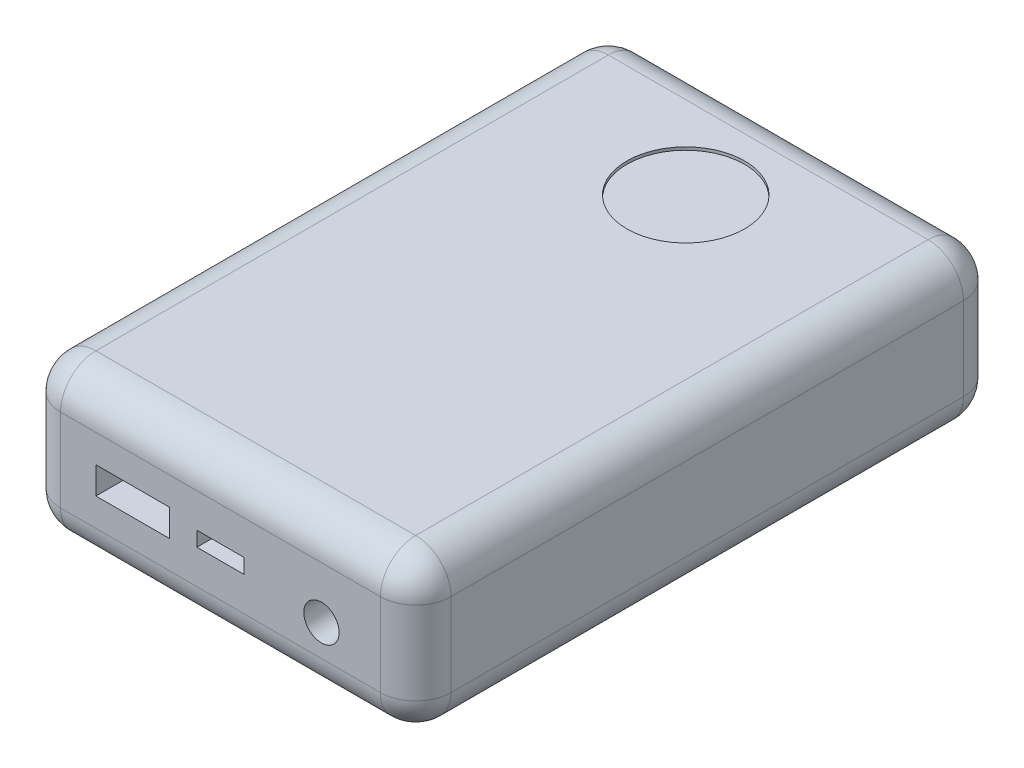
ISO-10303-21;
HEADER;
FILE_DESCRIPTION(('STEP AP214'),'2;1');
FILE_NAME('part.step','',(''),(''),'','','');
FILE_SCHEMA(('AUTOMOTIVE_DESIGN { 1 0 10303 214 1 1 1 1 }'));
ENDSEC;
DATA;
#1=APPLICATION_CONTEXT('core data for automotive mechanical design processes');
#2=APPLICATION_PROTOCOL_DEFINITION('international standard','automotive_design',2000,#1);
#3=PRODUCT_CONTEXT('',#1,'mechanical');
#4=PRODUCT('Part','Part','',(#3));
#5=PRODUCT_RELATED_PRODUCT_CATEGORY('part','',(#4));
#6=PRODUCT_DEFINITION_FORMATION('','',#4);
#7=PRODUCT_DEFINITION_CONTEXT('part definition',#1,'design');
#8=PRODUCT_DEFINITION('design','',#6,#7);
#9=PRODUCT_DEFINITION_SHAPE('','',#8);
#10=(LENGTH_UNIT() NAMED_UNIT(*) SI_UNIT(.MILLI.,.METRE.));
#11=(NAMED_UNIT(*) PLANE_ANGLE_UNIT() SI_UNIT($,.RADIAN.));
#12=(NAMED_UNIT(*) SI_UNIT($,.STERADIAN.) SOLID_ANGLE_UNIT());
#13=UNCERTAINTY_MEASURE_WITH_UNIT(LENGTH_MEASURE(1.E-05),#10,'distance_accuracy_value','');
#14=(GEOMETRIC_REPRESENTATION_CONTEXT(3) GLOBAL_UNCERTAINTY_ASSIGNED_CONTEXT((#13)) GLOBAL_UNIT_ASSIGNED_CONTEXT((#10,
#11,#12)) REPRESENTATION_CONTEXT('',''));
#15=CARTESIAN_POINT('',(0.,0.,0.));
#16=DIRECTION('',(0.,0.,1.));
#17=DIRECTION('',(1.,0.,0.));
#18=AXIS2_PLACEMENT_3D('',#15,#16,#17);
#19=CARTESIAN_POINT('',(-33.15,0.,49.5));
#20=DIRECTION('',(1.,0.,0.));
#21=DIRECTION('',(0.,0.,-1.));
#22=AXIS2_PLACEMENT_3D('',#19,#20,#21);
#23=PLANE('',#22);
#24=DIRECTION('',(0.,0.,-1.));
#25=VECTOR('',#24,1.);
#26=CARTESIAN_POINT('',(-33.15,20.1,49.5));
#27=LINE('',#26,#25);
#28=CARTESIAN_POINT('',(-33.15,20.1,43.5));
#29=VERTEX_POINT('',#28);
#30=CARTESIAN_POINT('',(-33.15,20.1,-43.5));
#31=VERTEX_POINT('',#30);
#32=EDGE_CURVE('E286',#29,#31,#27,.T.);
#33=ORIENTED_EDGE('',*,*,#32,.T.);
#34=DIRECTION('',(0.,-1.,0.));
#35=VECTOR('',#34,1.);
#36=CARTESIAN_POINT('',(-33.15,0.,-43.5));
#37=LINE('',#36,#35);
#38=CARTESIAN_POINT('',(-33.15,6.,-43.5));
#39=VERTEX_POINT('',#38);
#40=EDGE_CURVE('E287',#31,#39,#37,.T.);
#41=ORIENTED_EDGE('',*,*,#40,.T.);
#42=DIRECTION('',(0.,0.,-1.));
#43=VECTOR('',#42,1.);
#44=CARTESIAN_POINT('',(-33.15,6.,49.5));
#45=LINE('',#44,#43);
#46=CARTESIAN_POINT('',(-33.15,6.,43.5));
#47=VERTEX_POINT('',#46);
#48=EDGE_CURVE('E282',#39,#47,#45,.F.);
#49=ORIENTED_EDGE('',*,*,#48,.T.);
#50=DIRECTION('',(0.,-1.,0.));
#51=VECTOR('',#50,1.);
#52=CARTESIAN_POINT('',(-33.15,0.,43.5));
#53=LINE('',#52,#51);
#54=EDGE_CURVE('E281',#47,#29,#53,.F.);
#55=ORIENTED_EDGE('',*,*,#54,.T.);
#56=EDGE_LOOP('',(#33,#41,#49,#55));
#57=FACE_BOUND('',#56,.T.);
#58=ADVANCED_FACE('F45',(#57),#23,.F.);
#59=CARTESIAN_POINT('',(-33.15,0.,49.5));
#60=DIRECTION('',(0.,1.,0.));
#61=DIRECTION('',(0.,0.,1.));
#62=AXIS2_PLACEMENT_3D('',#59,#60,#61);
#63=PLANE('',#62);
#64=DIRECTION('',(0.,0.,-1.));
#65=VECTOR('',#64,1.);
#66=CARTESIAN_POINT('',(-27.15,0.,49.5));
#67=LINE('',#66,#65);
#68=CARTESIAN_POINT('',(-27.15,0.,43.5));
#69=VERTEX_POINT('',#68);
#70=CARTESIAN_POINT('',(-27.15,0.,-43.5));
#71=VERTEX_POINT('',#70);
#72=EDGE_CURVE('E51',#69,#71,#67,.T.);
#73=ORIENTED_EDGE('',*,*,#72,.T.);
#74=DIRECTION('',(1.,0.,0.));
#75=VECTOR('',#74,1.);
#76=CARTESIAN_POINT('',(33.15,0.,-43.5));
#77=LINE('',#76,#75);
#78=CARTESIAN_POINT('',(27.15,0.,-43.5));
#79=VERTEX_POINT('',#78);
#80=EDGE_CURVE('E11',#71,#79,#77,.T.);
#81=ORIENTED_EDGE('',*,*,#80,.T.);
#82=DIRECTION('',(0.,0.,-1.));
#83=VECTOR('',#82,1.);
#84=CARTESIAN_POINT('',(27.15,0.,49.5));
#85=LINE('',#84,#83);
#86=CARTESIAN_POINT('',(27.15,0.,43.5));
#87=VERTEX_POINT('',#86);
#88=EDGE_CURVE('E302',#79,#87,#85,.F.);
#89=ORIENTED_EDGE('',*,*,#88,.T.);
#90=DIRECTION('',(1.,0.,0.));
#91=VECTOR('',#90,1.);
#92=CARTESIAN_POINT('',(-33.15,0.,43.5));
#93=LINE('',#92,#91);
#94=EDGE_CURVE('E65',#87,#69,#93,.F.);
#95=ORIENTED_EDGE('',*,*,#94,.T.);
#96=EDGE_LOOP('',(#73,#81,#89,#95));
#97=FACE_BOUND('',#96,.T.);
#98=ADVANCED_FACE('F408',(#97),#63,.F.);
#99=CARTESIAN_POINT('',(33.15,0.,49.5));
#100=DIRECTION('',(-1.,0.,0.));
#101=DIRECTION('',(0.,0.,1.));
#102=AXIS2_PLACEMENT_3D('',#99,#100,#101);
#103=PLANE('',#102);
#104=DIRECTION('',(0.,0.,-1.));
#105=VECTOR('',#104,1.);
#106=CARTESIAN_POINT('',(33.15,20.1,49.5));
#107=LINE('',#106,#105);
#108=CARTESIAN_POINT('',(33.15,20.1,-43.5));
#109=VERTEX_POINT('',#108);
#110=CARTESIAN_POINT('',(33.15,20.1,43.5));
#111=VERTEX_POINT('',#110);
#112=EDGE_CURVE('E267',#109,#111,#107,.F.);
#113=ORIENTED_EDGE('',*,*,#112,.T.);
#114=DIRECTION('',(0.,1.,0.));
#115=VECTOR('',#114,1.);
#116=CARTESIAN_POINT('',(33.15,0.,43.5));
#117=LINE('',#116,#115);
#118=CARTESIAN_POINT('',(33.15,6.,43.5));
#119=VERTEX_POINT('',#118);
#120=EDGE_CURVE('E275',#111,#119,#117,.F.);
#121=ORIENTED_EDGE('',*,*,#120,.T.);
#122=DIRECTION('',(0.,0.,-1.));
#123=VECTOR('',#122,1.);
#124=CARTESIAN_POINT('',(33.15,6.,49.5));
#125=LINE('',#124,#123);
#126=CARTESIAN_POINT('',(33.15,6.,-43.5));
#127=VERTEX_POINT('',#126);
#128=EDGE_CURVE('E270',#119,#127,#125,.T.);
#129=ORIENTED_EDGE('',*,*,#128,.T.);
#130=DIRECTION('',(0.,1.,0.));
#131=VECTOR('',#130,1.);
#132=CARTESIAN_POINT('',(33.15,26.1,-43.5));
#133=LINE('',#132,#131);
#134=EDGE_CURVE('E264',#127,#109,#133,.T.);
#135=ORIENTED_EDGE('',*,*,#134,.T.);
#136=EDGE_LOOP('',(#113,#121,#129,#135));
#137=FACE_BOUND('',#136,.T.);
#138=ADVANCED_FACE('F414',(#137),#103,.F.);
#139=CARTESIAN_POINT('',(-33.15,26.1,49.5));
#140=DIRECTION('',(0.,-1.,0.));
#141=DIRECTION('',(0.,0.,-1.));
#142=AXIS2_PLACEMENT_3D('',#139,#140,#141);
#143=PLANE('',#142);
#144=DIRECTION('',(-1.,0.,0.));
#145=VECTOR('',#144,1.);
#146=CARTESIAN_POINT('',(-33.15,26.1,43.5));
#147=LINE('',#146,#145);
#148=CARTESIAN_POINT('',(-27.15,26.1,43.5));
#149=VERTEX_POINT('',#148);
#150=CARTESIAN_POINT('',(27.15,26.1,43.5));
#151=VERTEX_POINT('',#150);
#152=EDGE_CURVE('E257',#149,#151,#147,.F.);
#153=ORIENTED_EDGE('',*,*,#152,.T.);
#154=DIRECTION('',(0.,0.,-1.));
#155=VECTOR('',#154,1.);
#156=CARTESIAN_POINT('',(27.15,26.1,49.5));
#157=LINE('',#156,#155);
#158=CARTESIAN_POINT('',(27.15,26.1,-43.5));
#159=VERTEX_POINT('',#158);
#160=EDGE_CURVE('E265',#151,#159,#157,.T.);
#161=ORIENTED_EDGE('',*,*,#160,.T.);
#162=DIRECTION('',(-1.,0.,0.));
#163=VECTOR('',#162,1.);
#164=CARTESIAN_POINT('',(-33.15,26.1,-43.5));
#165=LINE('',#164,#163);
#166=CARTESIAN_POINT('',(-27.15,26.1,-43.5));
#167=VERTEX_POINT('',#166);
#168=EDGE_CURVE('E248',#159,#167,#165,.T.);
#169=ORIENTED_EDGE('',*,*,#168,.T.);
#170=DIRECTION('',(0.,0.,-1.));
#171=VECTOR('',#170,1.);
#172=CARTESIAN_POINT('',(-27.15,26.1,49.5));
#173=LINE('',#172,#171);
#174=EDGE_CURVE('E256',#167,#149,#173,.F.);
#175=ORIENTED_EDGE('',*,*,#174,.T.);
#176=EDGE_LOOP('',(#153,#161,#169,#175));
#177=FACE_BOUND('',#176,.T.);
#178=CARTESIAN_POINT('',(0.,26.1,-29.5));
#179=DIRECTION('',(0.,1.,0.));
#180=DIRECTION('',(0.,0.,1.));
#181=AXIS2_PLACEMENT_3D('',#178,#179,#180);
#182=CIRCLE('',#181,10.);
#183=CARTESIAN_POINT('',(0.,26.1,-19.5));
#184=VERTEX_POINT('',#183);
#185=EDGE_CURVE('E367',#184,#184,#182,.T.);
#186=ORIENTED_EDGE('',*,*,#185,.F.);
#187=EDGE_LOOP('',(#186));
#188=FACE_BOUND('',#187,.T.);
#189=ADVANCED_FACE('F527',(#177,#188),#143,.F.);
#190=CARTESIAN_POINT('',(0.,0.,49.5));
#191=DIRECTION('',(0.,0.,-1.));
#192=DIRECTION('',(-1.,0.,0.));
#193=AXIS2_PLACEMENT_3D('',#190,#191,#192);
#194=PLANE('',#193);
#195=DIRECTION('',(-1.,0.,0.));
#196=VECTOR('',#195,1.);
#197=CARTESIAN_POINT('',(0.,20.1,49.5));
#198=LINE('',#197,#196);
#199=CARTESIAN_POINT('',(27.15,20.1,49.5));
#200=VERTEX_POINT('',#199);
#201=CARTESIAN_POINT('',(-27.15,20.1,49.5));
#202=VERTEX_POINT('',#201);
#203=EDGE_CURVE('E279',#200,#202,#198,.T.);
#204=ORIENTED_EDGE('',*,*,#203,.T.);
#205=DIRECTION('',(0.,-1.,0.));
#206=VECTOR('',#205,1.);
#207=CARTESIAN_POINT('',(-27.15,0.,49.5));
#208=LINE('',#207,#206);
#209=CARTESIAN_POINT('',(-27.15,6.,49.5));
#210=VERTEX_POINT('',#209);
#211=EDGE_CURVE('E283',#202,#210,#208,.T.);
#212=ORIENTED_EDGE('',*,*,#211,.T.);
#213=DIRECTION('',(1.,0.,0.));
#214=VECTOR('',#213,1.);
#215=CARTESIAN_POINT('',(0.,6.,49.5));
#216=LINE('',#215,#214);
#217=CARTESIAN_POINT('',(27.15,6.,49.5));
#218=VERTEX_POINT('',#217);
#219=EDGE_CURVE('E277',#210,#218,#216,.T.);
#220=ORIENTED_EDGE('',*,*,#219,.T.);
#221=DIRECTION('',(0.,1.,0.));
#222=VECTOR('',#221,1.);
#223=CARTESIAN_POINT('',(27.15,0.,49.5));
#224=LINE('',#223,#222);
#225=EDGE_CURVE('E273',#218,#200,#224,.T.);
#226=ORIENTED_EDGE('',*,*,#225,.T.);
#227=EDGE_LOOP('',(#204,#212,#220,#226));
#228=FACE_BOUND('',#227,.T.);
#229=CARTESIAN_POINT('',(17.15,11.3,49.5));
#230=DIRECTION('',(0.,0.,1.));
#231=DIRECTION('',(1.,0.,0.));
#232=AXIS2_PLACEMENT_3D('',#229,#230,#231);
#233=CIRCLE('',#232,3.);
#234=CARTESIAN_POINT('',(20.15,11.3,49.5));
#235=VERTEX_POINT('',#234);
#236=EDGE_CURVE('E189',#235,#235,#233,.T.);
#237=ORIENTED_EDGE('',*,*,#236,.F.);
#238=EDGE_LOOP('',(#237));
#239=FACE_BOUND('',#238,.T.);
#240=DIRECTION('',(-1.,0.,0.));
#241=VECTOR('',#240,1.);
#242=CARTESIAN_POINT('',(-21.15,15.35,49.5));
#243=LINE('',#242,#241);
#244=CARTESIAN_POINT('',(-8.65,15.35,49.5));
#245=VERTEX_POINT('',#244);
#246=CARTESIAN_POINT('',(-21.15,15.35,49.5));
#247=VERTEX_POINT('',#246);
#248=EDGE_CURVE('E201',#245,#247,#243,.T.);
#249=ORIENTED_EDGE('',*,*,#248,.F.);
#250=DIRECTION('',(0.,1.,0.));
#251=VECTOR('',#250,1.);
#252=CARTESIAN_POINT('',(-8.65,15.35,49.5));
#253=LINE('',#252,#251);
#254=CARTESIAN_POINT('',(-8.65,10.75,49.5));
#255=VERTEX_POINT('',#254);
#256=EDGE_CURVE('E182',#255,#245,#253,.T.);
#257=ORIENTED_EDGE('',*,*,#256,.F.);
#258=DIRECTION('',(1.,0.,0.));
#259=VECTOR('',#258,1.);
#260=CARTESIAN_POINT('',(-21.15,10.75,49.5));
#261=LINE('',#260,#259);
#262=CARTESIAN_POINT('',(-21.15,10.75,49.5));
#263=VERTEX_POINT('',#262);
#264=EDGE_CURVE('E195',#263,#255,#261,.T.);
#265=ORIENTED_EDGE('',*,*,#264,.F.);
#266=DIRECTION('',(0.,-1.,0.));
#267=VECTOR('',#266,1.);
#268=CARTESIAN_POINT('',(-21.15,15.35,49.5));
#269=LINE('',#268,#267);
#270=EDGE_CURVE('E197',#247,#263,#269,.T.);
#271=ORIENTED_EDGE('',*,*,#270,.F.);
#272=EDGE_LOOP('',(#249,#257,#265,#271));
#273=FACE_BOUND('',#272,.T.);
#274=DIRECTION('',(-1.,0.,0.));
#275=VECTOR('',#274,1.);
#276=CARTESIAN_POINT('',(-4.,14.3,49.5));
#277=LINE('',#276,#275);
#278=CARTESIAN_POINT('',(4.,14.3,49.5));
#279=VERTEX_POINT('',#278);
#280=CARTESIAN_POINT('',(-4.,14.3,49.5));
#281=VERTEX_POINT('',#280);
#282=EDGE_CURVE('E206',#279,#281,#277,.T.);
#283=ORIENTED_EDGE('',*,*,#282,.F.);
#284=DIRECTION('',(0.,1.,0.));
#285=VECTOR('',#284,1.);
#286=CARTESIAN_POINT('',(4.,14.3,49.5));
#287=LINE('',#286,#285);
#288=CARTESIAN_POINT('',(4.,11.8,49.5));
#289=VERTEX_POINT('',#288);
#290=EDGE_CURVE('E204',#289,#279,#287,.T.);
#291=ORIENTED_EDGE('',*,*,#290,.F.);
#292=DIRECTION('',(1.,0.,0.));
#293=VECTOR('',#292,1.);
#294=CARTESIAN_POINT('',(-4.,11.8,49.5));
#295=LINE('',#294,#293);
#296=CARTESIAN_POINT('',(-4.,11.8,49.5));
#297=VERTEX_POINT('',#296);
#298=EDGE_CURVE('E234',#297,#289,#295,.T.);
#299=ORIENTED_EDGE('',*,*,#298,.F.);
#300=DIRECTION('',(0.,-1.,0.));
#301=VECTOR('',#300,1.);
#302=CARTESIAN_POINT('',(-4.,14.3,49.5));
#303=LINE('',#302,#301);
#304=EDGE_CURVE('E241',#281,#297,#303,.T.);
#305=ORIENTED_EDGE('',*,*,#304,.F.);
#306=EDGE_LOOP('',(#283,#291,#299,#305));
#307=FACE_BOUND('',#306,.T.);
#308=ADVANCED_FACE('F199',(#228,#239,#273,#307),#194,.F.);
#309=CARTESIAN_POINT('',(0.,0.,-49.5));
#310=DIRECTION('',(0.,0.,-1.));
#311=DIRECTION('',(-1.,0.,0.));
#312=AXIS2_PLACEMENT_3D('',#309,#310,#311);
#313=PLANE('',#312);
#314=DIRECTION('',(1.,0.,0.));
#315=VECTOR('',#314,1.);
#316=CARTESIAN_POINT('',(-33.15,6.,-49.5));
#317=LINE('',#316,#315);
#318=CARTESIAN_POINT('',(27.15,6.,-49.5));
#319=VERTEX_POINT('',#318);
#320=CARTESIAN_POINT('',(-27.15,6.,-49.5));
#321=VERTEX_POINT('',#320);
#322=EDGE_CURVE('E294',#319,#321,#317,.F.);
#323=ORIENTED_EDGE('',*,*,#322,.T.);
#324=DIRECTION('',(0.,-1.,0.));
#325=VECTOR('',#324,1.);
#326=CARTESIAN_POINT('',(-27.15,26.1,-49.5));
#327=LINE('',#326,#325);
#328=CARTESIAN_POINT('',(-27.15,20.1,-49.5));
#329=VERTEX_POINT('',#328);
#330=EDGE_CURVE('E299',#321,#329,#327,.F.);
#331=ORIENTED_EDGE('',*,*,#330,.T.);
#332=DIRECTION('',(-1.,0.,0.));
#333=VECTOR('',#332,1.);
#334=CARTESIAN_POINT('',(33.15,20.1,-49.5));
#335=LINE('',#334,#333);
#336=CARTESIAN_POINT('',(27.15,20.1,-49.5));
#337=VERTEX_POINT('',#336);
#338=EDGE_CURVE('E298',#329,#337,#335,.F.);
#339=ORIENTED_EDGE('',*,*,#338,.T.);
#340=DIRECTION('',(0.,1.,0.));
#341=VECTOR('',#340,1.);
#342=CARTESIAN_POINT('',(27.15,0.,-49.5));
#343=LINE('',#342,#341);
#344=EDGE_CURVE('E295',#337,#319,#343,.F.);
#345=ORIENTED_EDGE('',*,*,#344,.T.);
#346=EDGE_LOOP('',(#323,#331,#339,#345));
#347=FACE_BOUND('',#346,.T.);
#348=ADVANCED_FACE('F532',(#347),#313,.T.);
#349=CARTESIAN_POINT('',(4.,14.3,36.5));
#350=DIRECTION('',(1.,0.,0.));
#351=DIRECTION('',(0.,0.,-1.));
#352=AXIS2_PLACEMENT_3D('',#349,#350,#351);
#353=PLANE('',#352);
#354=ORIENTED_EDGE('',*,*,#290,.T.);
#355=DIRECTION('',(0.,0.,1.));
#356=VECTOR('',#355,1.);
#357=CARTESIAN_POINT('',(4.,14.3,36.5));
#358=LINE('',#357,#356);
#359=CARTESIAN_POINT('',(4.,14.3,36.5));
#360=VERTEX_POINT('',#359);
#361=EDGE_CURVE('E239',#360,#279,#358,.T.);
#362=ORIENTED_EDGE('',*,*,#361,.F.);
#363=DIRECTION('',(0.,1.,0.));
#364=VECTOR('',#363,1.);
#365=CARTESIAN_POINT('',(4.,14.3,36.5));
#366=LINE('',#365,#364);
#367=CARTESIAN_POINT('',(4.,11.8,36.5));
#368=VERTEX_POINT('',#367);
#369=EDGE_CURVE('E230',#368,#360,#366,.T.);
#370=ORIENTED_EDGE('',*,*,#369,.F.);
#371=DIRECTION('',(0.,0.,1.));
#372=VECTOR('',#371,1.);
#373=CARTESIAN_POINT('',(4.,11.8,36.5));
#374=LINE('',#373,#372);
#375=EDGE_CURVE('E249',#368,#289,#374,.T.);
#376=ORIENTED_EDGE('',*,*,#375,.T.);
#377=EDGE_LOOP('',(#354,#362,#370,#376));
#378=FACE_BOUND('',#377,.T.);
#379=ADVANCED_FACE('F549',(#378),#353,.F.);
#380=CARTESIAN_POINT('',(-4.,11.8,36.5));
#381=DIRECTION('',(0.,-1.,0.));
#382=DIRECTION('',(0.,0.,-1.));
#383=AXIS2_PLACEMENT_3D('',#380,#381,#382);
#384=PLANE('',#383);
#385=ORIENTED_EDGE('',*,*,#298,.T.);
#386=ORIENTED_EDGE('',*,*,#375,.F.);
#387=DIRECTION('',(1.,0.,0.));
#388=VECTOR('',#387,1.);
#389=CARTESIAN_POINT('',(-4.,11.8,36.5));
#390=LINE('',#389,#388);
#391=CARTESIAN_POINT('',(-4.,11.8,36.5));
#392=VERTEX_POINT('',#391);
#393=EDGE_CURVE('E240',#392,#368,#390,.T.);
#394=ORIENTED_EDGE('',*,*,#393,.F.);
#395=DIRECTION('',(0.,0.,1.));
#396=VECTOR('',#395,1.);
#397=CARTESIAN_POINT('',(-4.,11.8,36.5));
#398=LINE('',#397,#396);
#399=EDGE_CURVE('E253',#392,#297,#398,.T.);
#400=ORIENTED_EDGE('',*,*,#399,.T.);
#401=EDGE_LOOP('',(#385,#386,#394,#400));
#402=FACE_BOUND('',#401,.T.);
#403=ADVANCED_FACE('F553',(#402),#384,.F.);
#404=CARTESIAN_POINT('',(-4.,14.3,36.5));
#405=DIRECTION('',(-1.,0.,0.));
#406=DIRECTION('',(0.,0.,1.));
#407=AXIS2_PLACEMENT_3D('',#404,#405,#406);
#408=PLANE('',#407);
#409=ORIENTED_EDGE('',*,*,#304,.T.);
#410=ORIENTED_EDGE('',*,*,#399,.F.);
#411=DIRECTION('',(0.,-1.,0.));
#412=VECTOR('',#411,1.);
#413=CARTESIAN_POINT('',(-4.,14.3,36.5));
#414=LINE('',#413,#412);
#415=CARTESIAN_POINT('',(-4.,14.3,36.5));
#416=VERTEX_POINT('',#415);
#417=EDGE_CURVE('E233',#416,#392,#414,.T.);
#418=ORIENTED_EDGE('',*,*,#417,.F.);
#419=DIRECTION('',(0.,0.,1.));
#420=VECTOR('',#419,1.);
#421=CARTESIAN_POINT('',(-4.,14.3,36.5));
#422=LINE('',#421,#420);
#423=EDGE_CURVE('E251',#416,#281,#422,.T.);
#424=ORIENTED_EDGE('',*,*,#423,.T.);
#425=EDGE_LOOP('',(#409,#410,#418,#424));
#426=FACE_BOUND('',#425,.T.);
#427=ADVANCED_FACE('F564',(#426),#408,.F.);
#428=CARTESIAN_POINT('',(-4.,14.3,36.5));
#429=DIRECTION('',(0.,1.,0.));
#430=DIRECTION('',(0.,0.,1.));
#431=AXIS2_PLACEMENT_3D('',#428,#429,#430);
#432=PLANE('',#431);
#433=ORIENTED_EDGE('',*,*,#282,.T.);
#434=ORIENTED_EDGE('',*,*,#423,.F.);
#435=DIRECTION('',(-1.,0.,0.));
#436=VECTOR('',#435,1.);
#437=CARTESIAN_POINT('',(-4.,14.3,36.5));
#438=LINE('',#437,#436);
#439=EDGE_CURVE('E227',#360,#416,#438,.T.);
#440=ORIENTED_EDGE('',*,*,#439,.F.);
#441=ORIENTED_EDGE('',*,*,#361,.T.);
#442=EDGE_LOOP('',(#433,#434,#440,#441));
#443=FACE_BOUND('',#442,.T.);
#444=ADVANCED_FACE('F560',(#443),#432,.F.);
#445=CARTESIAN_POINT('',(0.,0.,36.5));
#446=DIRECTION('',(0.,0.,1.));
#447=DIRECTION('',(1.,0.,0.));
#448=AXIS2_PLACEMENT_3D('',#445,#446,#447);
#449=PLANE('',#448);
#450=ORIENTED_EDGE('',*,*,#369,.T.);
#451=ORIENTED_EDGE('',*,*,#439,.T.);
#452=ORIENTED_EDGE('',*,*,#417,.T.);
#453=ORIENTED_EDGE('',*,*,#393,.T.);
#454=EDGE_LOOP('',(#450,#451,#452,#453));
#455=FACE_BOUND('',#454,.T.);
#456=ADVANCED_FACE('F557',(#455),#449,.T.);
#457=CARTESIAN_POINT('',(-8.65,15.35,36.5));
#458=DIRECTION('',(1.,0.,0.));
#459=DIRECTION('',(0.,1.,0.));
#460=AXIS2_PLACEMENT_3D('',#457,#458,#459);
#461=PLANE('',#460);
#462=ORIENTED_EDGE('',*,*,#256,.T.);
#463=DIRECTION('',(0.,0.,1.));
#464=VECTOR('',#463,1.);
#465=CARTESIAN_POINT('',(-8.65,15.35,36.5));
#466=LINE('',#465,#464);
#467=CARTESIAN_POINT('',(-8.65,15.35,36.5));
#468=VERTEX_POINT('',#467);
#469=EDGE_CURVE('E212',#468,#245,#466,.T.);
#470=ORIENTED_EDGE('',*,*,#469,.F.);
#471=DIRECTION('',(0.,1.,0.));
#472=VECTOR('',#471,1.);
#473=CARTESIAN_POINT('',(-8.65,15.35,36.5));
#474=LINE('',#473,#472);
#475=CARTESIAN_POINT('',(-8.65,10.75,36.5));
#476=VERTEX_POINT('',#475);
#477=EDGE_CURVE('E184',#476,#468,#474,.T.);
#478=ORIENTED_EDGE('',*,*,#477,.F.);
#479=DIRECTION('',(0.,0.,1.));
#480=VECTOR('',#479,1.);
#481=CARTESIAN_POINT('',(-8.65,10.75,36.5));
#482=LINE('',#481,#480);
#483=EDGE_CURVE('E176',#476,#255,#482,.T.);
#484=ORIENTED_EDGE('',*,*,#483,.T.);
#485=EDGE_LOOP('',(#462,#470,#478,#484));
#486=FACE_BOUND('',#485,.T.);
#487=ADVANCED_FACE('F178',(#486),#461,.F.);
#488=CARTESIAN_POINT('',(-21.15,10.75,36.5));
#489=DIRECTION('',(0.,-1.,0.));
#490=DIRECTION('',(0.,0.,-1.));
#491=AXIS2_PLACEMENT_3D('',#488,#489,#490);
#492=PLANE('',#491);
#493=ORIENTED_EDGE('',*,*,#264,.T.);
#494=ORIENTED_EDGE('',*,*,#483,.F.);
#495=DIRECTION('',(1.,0.,0.));
#496=VECTOR('',#495,1.);
#497=CARTESIAN_POINT('',(-21.15,10.75,36.5));
#498=LINE('',#497,#496);
#499=CARTESIAN_POINT('',(-21.15,10.75,36.5));
#500=VERTEX_POINT('',#499);
#501=EDGE_CURVE('E211',#500,#476,#498,.T.);
#502=ORIENTED_EDGE('',*,*,#501,.F.);
#503=DIRECTION('',(0.,0.,1.));
#504=VECTOR('',#503,1.);
#505=CARTESIAN_POINT('',(-21.15,10.75,36.5));
#506=LINE('',#505,#504);
#507=EDGE_CURVE('E186',#500,#263,#506,.T.);
#508=ORIENTED_EDGE('',*,*,#507,.T.);
#509=EDGE_LOOP('',(#493,#494,#502,#508));
#510=FACE_BOUND('',#509,.T.);
#511=ADVANCED_FACE('F194',(#510),#492,.F.);
#512=CARTESIAN_POINT('',(-21.15,15.35,36.5));
#513=DIRECTION('',(-1.,0.,0.));
#514=DIRECTION('',(0.,0.,1.));
#515=AXIS2_PLACEMENT_3D('',#512,#513,#514);
#516=PLANE('',#515);
#517=ORIENTED_EDGE('',*,*,#270,.T.);
#518=ORIENTED_EDGE('',*,*,#507,.F.);
#519=DIRECTION('',(0.,-1.,0.));
#520=VECTOR('',#519,1.);
#521=CARTESIAN_POINT('',(-21.15,15.35,36.5));
#522=LINE('',#521,#520);
#523=CARTESIAN_POINT('',(-21.15,15.35,36.5));
#524=VERTEX_POINT('',#523);
#525=EDGE_CURVE('E213',#524,#500,#522,.T.);
#526=ORIENTED_EDGE('',*,*,#525,.F.);
#527=DIRECTION('',(0.,0.,1.));
#528=VECTOR('',#527,1.);
#529=CARTESIAN_POINT('',(-21.15,15.35,36.5));
#530=LINE('',#529,#528);
#531=EDGE_CURVE('E382',#524,#247,#530,.T.);
#532=ORIENTED_EDGE('',*,*,#531,.T.);
#533=EDGE_LOOP('',(#517,#518,#526,#532));
#534=FACE_BOUND('',#533,.T.);
#535=ADVANCED_FACE('F387',(#534),#516,.F.);
#536=CARTESIAN_POINT('',(-21.15,15.35,36.5));
#537=DIRECTION('',(0.,1.,0.));
#538=DIRECTION('',(0.,0.,1.));
#539=AXIS2_PLACEMENT_3D('',#536,#537,#538);
#540=PLANE('',#539);
#541=ORIENTED_EDGE('',*,*,#248,.T.);
#542=ORIENTED_EDGE('',*,*,#531,.F.);
#543=DIRECTION('',(-1.,0.,0.));
#544=VECTOR('',#543,1.);
#545=CARTESIAN_POINT('',(-21.15,15.35,36.5));
#546=LINE('',#545,#544);
#547=EDGE_CURVE('E220',#468,#524,#546,.T.);
#548=ORIENTED_EDGE('',*,*,#547,.F.);
#549=ORIENTED_EDGE('',*,*,#469,.T.);
#550=EDGE_LOOP('',(#541,#542,#548,#549));
#551=FACE_BOUND('',#550,.T.);
#552=ADVANCED_FACE('F388',(#551),#540,.F.);
#553=CARTESIAN_POINT('',(0.,0.,36.5));
#554=DIRECTION('',(0.,0.,1.));
#555=DIRECTION('',(1.,0.,0.));
#556=AXIS2_PLACEMENT_3D('',#553,#554,#555);
#557=PLANE('',#556);
#558=ORIENTED_EDGE('',*,*,#477,.T.);
#559=ORIENTED_EDGE('',*,*,#547,.T.);
#560=ORIENTED_EDGE('',*,*,#525,.T.);
#561=ORIENTED_EDGE('',*,*,#501,.T.);
#562=EDGE_LOOP('',(#558,#559,#560,#561));
#563=FACE_BOUND('',#562,.T.);
#564=ADVANCED_FACE('F395',(#563),#557,.T.);
#565=CARTESIAN_POINT('',(17.15,11.3,36.5));
#566=DIRECTION('',(0.,0.,1.));
#567=DIRECTION('',(1.,0.,0.));
#568=AXIS2_PLACEMENT_3D('',#565,#566,#567);
#569=CYLINDRICAL_SURFACE('',#568,3.);
#570=CARTESIAN_POINT('',(17.15,11.3,36.5));
#571=DIRECTION('',(0.,0.,1.));
#572=DIRECTION('',(1.,0.,0.));
#573=AXIS2_PLACEMENT_3D('',#570,#571,#572);
#574=CIRCLE('',#573,3.);
#575=CARTESIAN_POINT('',(20.15,11.3,36.5));
#576=VERTEX_POINT('',#575);
#577=EDGE_CURVE('E224',#576,#576,#574,.T.);
#578=CARTESIAN_POINT('',(20.15,11.3,36.5));
#579=CARTESIAN_POINT('',(20.15,11.3,36.6354166666667));
#580=CARTESIAN_POINT('',(20.15,11.3,36.7708333333333));
#581=CARTESIAN_POINT('',(20.15,11.3,37.0416666666667));
#582=CARTESIAN_POINT('',(20.15,11.3,37.1770833333333));
#583=CARTESIAN_POINT('',(20.15,11.3,37.4479166666667));
#584=CARTESIAN_POINT('',(20.15,11.3,37.5833333333333));
#585=CARTESIAN_POINT('',(20.15,11.3,37.8541666666667));
#586=CARTESIAN_POINT('',(20.15,11.3,37.9895833333333));
#587=CARTESIAN_POINT('',(20.15,11.3,38.2604166666667));
#588=CARTESIAN_POINT('',(20.15,11.3,38.3958333333333));
#589=CARTESIAN_POINT('',(20.15,11.3,38.6666666666667));
#590=CARTESIAN_POINT('',(20.15,11.3,38.8020833333333));
#591=CARTESIAN_POINT('',(20.15,11.3,39.0729166666667));
#592=CARTESIAN_POINT('',(20.15,11.3,39.2083333333333));
#593=CARTESIAN_POINT('',(20.15,11.3,39.4791666666667));
#594=CARTESIAN_POINT('',(20.15,11.3,39.6145833333333));
#595=CARTESIAN_POINT('',(20.15,11.3,39.8854166666667));
#596=CARTESIAN_POINT('',(20.15,11.3,40.0208333333333));
#597=CARTESIAN_POINT('',(20.15,11.3,40.2916666666667));
#598=CARTESIAN_POINT('',(20.15,11.3,40.4270833333333));
#599=CARTESIAN_POINT('',(20.15,11.3,40.6979166666667));
#600=CARTESIAN_POINT('',(20.15,11.3,40.8333333333333));
#601=CARTESIAN_POINT('',(20.15,11.3,41.1041666666667));
#602=CARTESIAN_POINT('',(20.15,11.3,41.2395833333333));
#603=CARTESIAN_POINT('',(20.15,11.3,41.5104166666667));
#604=CARTESIAN_POINT('',(20.15,11.3,41.6458333333333));
#605=CARTESIAN_POINT('',(20.15,11.3,41.9166666666667));
#606=CARTESIAN_POINT('',(20.15,11.3,42.0520833333333));
#607=CARTESIAN_POINT('',(20.15,11.3,42.3229166666667));
#608=CARTESIAN_POINT('',(20.15,11.3,42.4583333333333));
#609=CARTESIAN_POINT('',(20.15,11.3,42.7291666666667));
#610=CARTESIAN_POINT('',(20.15,11.3,42.8645833333333));
#611=CARTESIAN_POINT('',(20.15,11.3,43.1354166666667));
#612=CARTESIAN_POINT('',(20.15,11.3,43.2708333333333));
#613=CARTESIAN_POINT('',(20.15,11.3,43.5416666666667));
#614=CARTESIAN_POINT('',(20.15,11.3,43.6770833333333));
#615=CARTESIAN_POINT('',(20.15,11.3,43.9479166666667));
#616=CARTESIAN_POINT('',(20.15,11.3,44.0833333333333));
#617=CARTESIAN_POINT('',(20.15,11.3,44.3541666666667));
#618=CARTESIAN_POINT('',(20.15,11.3,44.4895833333333));
#619=CARTESIAN_POINT('',(20.15,11.3,44.7604166666667));
#620=CARTESIAN_POINT('',(20.15,11.3,44.8958333333333));
#621=CARTESIAN_POINT('',(20.15,11.3,45.1666666666667));
#622=CARTESIAN_POINT('',(20.15,11.3,45.3020833333333));
#623=CARTESIAN_POINT('',(20.15,11.3,45.5729166666667));
#624=CARTESIAN_POINT('',(20.15,11.3,45.7083333333333));
#625=CARTESIAN_POINT('',(20.15,11.3,45.9791666666667));
#626=CARTESIAN_POINT('',(20.15,11.3,46.1145833333333));
#627=CARTESIAN_POINT('',(20.15,11.3,46.3854166666667));
#628=CARTESIAN_POINT('',(20.15,11.3,46.5208333333333));
#629=CARTESIAN_POINT('',(20.15,11.3,46.7916666666667));
#630=CARTESIAN_POINT('',(20.15,11.3,46.9270833333333));
#631=CARTESIAN_POINT('',(20.15,11.3,47.1979166666667));
#632=CARTESIAN_POINT('',(20.15,11.3,47.3333333333333));
#633=CARTESIAN_POINT('',(20.15,11.3,47.6041666666667));
#634=CARTESIAN_POINT('',(20.15,11.3,47.7395833333333));
#635=CARTESIAN_POINT('',(20.15,11.3,48.0104166666667));
#636=CARTESIAN_POINT('',(20.15,11.3,48.1458333333333));
#637=CARTESIAN_POINT('',(20.15,11.3,48.4166666666667));
#638=CARTESIAN_POINT('',(20.15,11.3,48.5520833333333));
#639=CARTESIAN_POINT('',(20.15,11.3,48.8229166666667));
#640=CARTESIAN_POINT('',(20.15,11.3,48.9583333333333));
#641=CARTESIAN_POINT('',(20.15,11.3,49.2291666666667));
#642=CARTESIAN_POINT('',(20.15,11.3,49.3645833333333));
#643=CARTESIAN_POINT('',(20.15,11.3,49.5));
#644=B_SPLINE_CURVE_WITH_KNOTS('',3,(#578,#579,#580,#581,#582,#583,#584,#585,#586,#587,#588,
#589,#590,#591,#592,#593,#594,#595,#596,#597,#598,#599,#600,#601,#602,#603,#604,#605,#606,#607,
#608,#609,#610,#611,#612,#613,#614,#615,#616,#617,#618,#619,#620,#621,#622,#623,#624,#625,#626,
#627,#628,#629,#630,#631,#632,#633,#634,#635,#636,#637,#638,#639,#640,#641,#642,#643),
.UNSPECIFIED.,.F.,.F.,(4,2,2,2,2,2,2,2,2,2,2,2,2,2,2,2,2,2,2,2,2,2,2,2,2,2,2,2,2,2,2,2,4),(0.,
0.406249999999997,0.812499999999994,1.21875,1.62499999999999,2.03125,2.4375,2.84374999999999,
3.25,3.65624999999999,4.0625,4.46874999999999,4.875,5.28124999999999,5.6875,6.09374999999999,
6.49999999999999,6.90625,7.31249999999999,7.71875,8.12499999999999,8.53124999999999,
8.93749999999999,9.34374999999999,9.74999999999999,10.15625,10.5625,10.96875,11.375,11.78125,
12.1875,12.59375,13.),.UNSPECIFIED.);
#645=EDGE_CURVE('BSEAM394',#576,#235,#644,.T.);
#646=ORIENTED_EDGE('',*,*,#577,.F.);
#647=ORIENTED_EDGE('',*,*,#236,.T.);
#648=ORIENTED_EDGE('',*,*,#645,.T.);
#649=ORIENTED_EDGE('',*,*,#645,.F.);
#650=EDGE_LOOP('',(#646,#648,#647,#649));
#651=FACE_BOUND('',#650,.T.);
#652=ADVANCED_FACE('F394',(#651),#569,.F.);
#653=CARTESIAN_POINT('',(17.15,11.3,36.5));
#654=DIRECTION('',(0.,0.,1.));
#655=DIRECTION('',(1.,0.,0.));
#656=AXIS2_PLACEMENT_3D('',#653,#654,#655);
#657=PLANE('',#656);
#658=ORIENTED_EDGE('',*,*,#577,.T.);
#659=EDGE_LOOP('',(#658));
#660=FACE_BOUND('',#659,.T.);
#661=ADVANCED_FACE('F397',(#660),#657,.T.);
#662=CARTESIAN_POINT('',(0.,25.6,-29.5));
#663=DIRECTION('',(0.,1.,0.));
#664=DIRECTION('',(0.,0.,1.));
#665=AXIS2_PLACEMENT_3D('',#662,#663,#664);
#666=CYLINDRICAL_SURFACE('',#665,10.);
#667=CARTESIAN_POINT('',(0.,25.6,-29.5));
#668=DIRECTION('',(0.,1.,0.));
#669=DIRECTION('',(0.,0.,1.));
#670=AXIS2_PLACEMENT_3D('',#667,#668,#669);
#671=CIRCLE('',#670,10.);
#672=CARTESIAN_POINT('',(0.,25.6,-19.5));
#673=VERTEX_POINT('',#672);
#674=EDGE_CURVE('E228',#673,#673,#671,.T.);
#675=ORIENTED_EDGE('',*,*,#674,.F.);
#676=EDGE_LOOP('',(#675));
#677=FACE_BOUND('',#676,.T.);
#678=ORIENTED_EDGE('',*,*,#185,.T.);
#679=EDGE_LOOP('',(#678));
#680=FACE_BOUND('',#679,.T.);
#681=ADVANCED_FACE('F571',(#677,#680),#666,.F.);
#682=CARTESIAN_POINT('',(0.,25.6,-29.5));
#683=DIRECTION('',(0.,1.,0.));
#684=DIRECTION('',(0.,0.,1.));
#685=AXIS2_PLACEMENT_3D('',#682,#683,#684);
#686=PLANE('',#685);
#687=ORIENTED_EDGE('',*,*,#674,.T.);
#688=EDGE_LOOP('',(#687));
#689=FACE_BOUND('',#688,.T.);
#690=ADVANCED_FACE('F495',(#689),#686,.T.);
#691=CARTESIAN_POINT('',(-27.15,6.,49.5));
#692=DIRECTION('',(0.,0.,-1.));
#693=DIRECTION('',(-1.,0.,0.));
#694=AXIS2_PLACEMENT_3D('',#691,#692,#693);
#695=CYLINDRICAL_SURFACE('',#694,6.);
#696=CARTESIAN_POINT('',(-27.15,6.,43.5));
#697=DIRECTION('',(0.,0.,1.));
#698=DIRECTION('',(1.,0.,0.));
#699=AXIS2_PLACEMENT_3D('',#696,#697,#698);
#700=CIRCLE('',#699,6.);
#701=EDGE_CURVE('E46',#47,#69,#700,.T.);
#702=ORIENTED_EDGE('',*,*,#701,.F.);
#703=ORIENTED_EDGE('',*,*,#48,.F.);
#704=CARTESIAN_POINT('',(-27.15,6.,-43.5));
#705=DIRECTION('',(0.,0.,-1.));
#706=DIRECTION('',(-1.,0.,0.));
#707=AXIS2_PLACEMENT_3D('',#704,#705,#706);
#708=CIRCLE('',#707,6.);
#709=EDGE_CURVE('E365',#71,#39,#708,.T.);
#710=ORIENTED_EDGE('',*,*,#709,.F.);
#711=ORIENTED_EDGE('',*,*,#72,.F.);
#712=EDGE_LOOP('',(#702,#703,#710,#711));
#713=FACE_BOUND('',#712,.T.);
#714=ADVANCED_FACE('F42',(#713),#695,.T.);
#715=CARTESIAN_POINT('',(-27.15,6.,43.5));
#716=DIRECTION('',(0.,-1.,0.));
#717=DIRECTION('',(0.,0.,-1.));
#718=AXIS2_PLACEMENT_3D('',#715,#716,#717);
#719=SPHERICAL_SURFACE('',#718,6.);
#720=CARTESIAN_POINT('',(-27.15,6.,43.5));
#721=DIRECTION('',(0.,-1.,0.));
#722=DIRECTION('',(0.,0.,-1.));
#723=AXIS2_PLACEMENT_3D('',#720,#721,#722);
#724=CIRCLE('',#723,6.);
#725=EDGE_CURVE('E356',#47,#210,#724,.F.);
#726=ORIENTED_EDGE('',*,*,#725,.F.);
#727=ORIENTED_EDGE('',*,*,#701,.T.);
#728=CARTESIAN_POINT('',(-27.15,6.,43.5));
#729=DIRECTION('',(-1.,0.,0.));
#730=DIRECTION('',(0.,0.,1.));
#731=AXIS2_PLACEMENT_3D('',#728,#729,#730);
#732=CIRCLE('',#731,6.);
#733=EDGE_CURVE('E362',#210,#69,#732,.F.);
#734=ORIENTED_EDGE('',*,*,#733,.F.);
#735=EDGE_LOOP('',(#726,#727,#734));
#736=FACE_BOUND('',#735,.T.);
#737=ADVANCED_FACE('F490',(#736),#719,.T.);
#738=CARTESIAN_POINT('',(-27.15,6.,-43.5));
#739=DIRECTION('',(-1.,0.,0.));
#740=DIRECTION('',(0.,0.,1.));
#741=AXIS2_PLACEMENT_3D('',#738,#739,#740);
#742=SPHERICAL_SURFACE('',#741,6.);
#743=CARTESIAN_POINT('',(-27.15,6.,-43.5));
#744=DIRECTION('',(-1.,0.,0.));
#745=DIRECTION('',(0.,0.,1.));
#746=AXIS2_PLACEMENT_3D('',#743,#744,#745);
#747=CIRCLE('',#746,6.);
#748=EDGE_CURVE('E351',#71,#321,#747,.F.);
#749=ORIENTED_EDGE('',*,*,#748,.F.);
#750=ORIENTED_EDGE('',*,*,#709,.T.);
#751=CARTESIAN_POINT('',(-27.15,6.,-43.5));
#752=DIRECTION('',(0.,-1.,0.));
#753=DIRECTION('',(0.,0.,-1.));
#754=AXIS2_PLACEMENT_3D('',#751,#752,#753);
#755=CIRCLE('',#754,6.);
#756=EDGE_CURVE('E357',#321,#39,#755,.F.);
#757=ORIENTED_EDGE('',*,*,#756,.F.);
#758=EDGE_LOOP('',(#749,#750,#757));
#759=FACE_BOUND('',#758,.T.);
#760=ADVANCED_FACE('F482',(#759),#742,.T.);
#761=CARTESIAN_POINT('',(0.,6.,43.5));
#762=DIRECTION('',(1.,0.,0.));
#763=DIRECTION('',(0.,0.,-1.));
#764=AXIS2_PLACEMENT_3D('',#761,#762,#763);
#765=CYLINDRICAL_SURFACE('',#764,6.);
#766=ORIENTED_EDGE('',*,*,#733,.T.);
#767=ORIENTED_EDGE('',*,*,#94,.F.);
#768=CARTESIAN_POINT('',(27.15,6.,43.5));
#769=DIRECTION('',(1.,0.,0.));
#770=DIRECTION('',(0.,0.,-1.));
#771=AXIS2_PLACEMENT_3D('',#768,#769,#770);
#772=CIRCLE('',#771,6.);
#773=EDGE_CURVE('E350',#218,#87,#772,.T.);
#774=ORIENTED_EDGE('',*,*,#773,.F.);
#775=ORIENTED_EDGE('',*,*,#219,.F.);
#776=EDGE_LOOP('',(#766,#767,#774,#775));
#777=FACE_BOUND('',#776,.T.);
#778=ADVANCED_FACE('F477',(#777),#765,.T.);
#779=CARTESIAN_POINT('',(-27.15,0.,43.5));
#780=DIRECTION('',(0.,-1.,0.));
#781=DIRECTION('',(0.,0.,-1.));
#782=AXIS2_PLACEMENT_3D('',#779,#780,#781);
#783=CYLINDRICAL_SURFACE('',#782,6.);
#784=ORIENTED_EDGE('',*,*,#725,.T.);
#785=ORIENTED_EDGE('',*,*,#211,.F.);
#786=CARTESIAN_POINT('',(-27.15,20.1,43.5));
#787=DIRECTION('',(0.,1.,0.));
#788=DIRECTION('',(0.,0.,1.));
#789=AXIS2_PLACEMENT_3D('',#786,#787,#788);
#790=CIRCLE('',#789,6.);
#791=EDGE_CURVE('E343',#29,#202,#790,.T.);
#792=ORIENTED_EDGE('',*,*,#791,.F.);
#793=ORIENTED_EDGE('',*,*,#54,.F.);
#794=EDGE_LOOP('',(#784,#785,#792,#793));
#795=FACE_BOUND('',#794,.T.);
#796=ADVANCED_FACE('F478',(#795),#783,.T.);
#797=CARTESIAN_POINT('',(-27.15,20.1,49.5));
#798=DIRECTION('',(0.,0.,-1.));
#799=DIRECTION('',(-1.,0.,0.));
#800=AXIS2_PLACEMENT_3D('',#797,#798,#799);
#801=CYLINDRICAL_SURFACE('',#800,6.);
#802=CARTESIAN_POINT('',(-27.15,20.1,-43.5));
#803=DIRECTION('',(0.,0.,-1.));
#804=DIRECTION('',(-1.,0.,0.));
#805=AXIS2_PLACEMENT_3D('',#802,#803,#804);
#806=CIRCLE('',#805,6.);
#807=EDGE_CURVE('E336',#31,#167,#806,.T.);
#808=ORIENTED_EDGE('',*,*,#807,.F.);
#809=ORIENTED_EDGE('',*,*,#32,.F.);
#810=CARTESIAN_POINT('',(-27.15,20.1,43.5));
#811=DIRECTION('',(0.,0.,1.));
#812=DIRECTION('',(1.,0.,0.));
#813=AXIS2_PLACEMENT_3D('',#810,#811,#812);
#814=CIRCLE('',#813,6.);
#815=EDGE_CURVE('E344',#149,#29,#814,.T.);
#816=ORIENTED_EDGE('',*,*,#815,.F.);
#817=ORIENTED_EDGE('',*,*,#174,.F.);
#818=EDGE_LOOP('',(#808,#809,#816,#817));
#819=FACE_BOUND('',#818,.T.);
#820=ADVANCED_FACE('F472',(#819),#801,.T.);
#821=CARTESIAN_POINT('',(-27.15,0.,-43.5));
#822=DIRECTION('',(0.,1.,0.));
#823=DIRECTION('',(0.,0.,1.));
#824=AXIS2_PLACEMENT_3D('',#821,#822,#823);
#825=CYLINDRICAL_SURFACE('',#824,6.);
#826=ORIENTED_EDGE('',*,*,#756,.T.);
#827=ORIENTED_EDGE('',*,*,#40,.F.);
#828=CARTESIAN_POINT('',(-27.15,20.1,-43.5));
#829=DIRECTION('',(0.,1.,0.));
#830=DIRECTION('',(0.,0.,1.));
#831=AXIS2_PLACEMENT_3D('',#828,#829,#830);
#832=CIRCLE('',#831,6.);
#833=EDGE_CURVE('E338',#329,#31,#832,.T.);
#834=ORIENTED_EDGE('',*,*,#833,.F.);
#835=ORIENTED_EDGE('',*,*,#330,.F.);
#836=EDGE_LOOP('',(#826,#827,#834,#835));
#837=FACE_BOUND('',#836,.T.);
#838=ADVANCED_FACE('F469',(#837),#825,.T.);
#839=CARTESIAN_POINT('',(-33.15,6.,-43.5));
#840=DIRECTION('',(-1.,0.,0.));
#841=DIRECTION('',(0.,0.,1.));
#842=AXIS2_PLACEMENT_3D('',#839,#840,#841);
#843=CYLINDRICAL_SURFACE('',#842,6.);
#844=ORIENTED_EDGE('',*,*,#748,.T.);
#845=ORIENTED_EDGE('',*,*,#322,.F.);
#846=CARTESIAN_POINT('',(27.15,6.,-43.5));
#847=DIRECTION('',(1.,0.,0.));
#848=DIRECTION('',(0.,0.,-1.));
#849=AXIS2_PLACEMENT_3D('',#846,#847,#848);
#850=CIRCLE('',#849,6.);
#851=EDGE_CURVE('E334',#79,#319,#850,.T.);
#852=ORIENTED_EDGE('',*,*,#851,.F.);
#853=ORIENTED_EDGE('',*,*,#80,.F.);
#854=EDGE_LOOP('',(#844,#845,#852,#853));
#855=FACE_BOUND('',#854,.T.);
#856=ADVANCED_FACE('F464',(#855),#843,.T.);
#857=CARTESIAN_POINT('',(27.15,6.,49.5));
#858=DIRECTION('',(0.,0.,-1.));
#859=DIRECTION('',(-1.,0.,0.));
#860=AXIS2_PLACEMENT_3D('',#857,#858,#859);
#861=CYLINDRICAL_SURFACE('',#860,6.);
#862=CARTESIAN_POINT('',(27.15,6.,43.5));
#863=DIRECTION('',(0.,0.,1.));
#864=DIRECTION('',(1.,0.,0.));
#865=AXIS2_PLACEMENT_3D('',#862,#863,#864);
#866=CIRCLE('',#865,6.);
#867=EDGE_CURVE('E348',#87,#119,#866,.T.);
#868=ORIENTED_EDGE('',*,*,#867,.F.);
#869=ORIENTED_EDGE('',*,*,#88,.F.);
#870=CARTESIAN_POINT('',(27.15,6.,-43.5));
#871=DIRECTION('',(0.,0.,-1.));
#872=DIRECTION('',(-1.,0.,0.));
#873=AXIS2_PLACEMENT_3D('',#870,#871,#872);
#874=CIRCLE('',#873,6.);
#875=EDGE_CURVE('E332',#127,#79,#874,.T.);
#876=ORIENTED_EDGE('',*,*,#875,.F.);
#877=ORIENTED_EDGE('',*,*,#128,.F.);
#878=EDGE_LOOP('',(#868,#869,#876,#877));
#879=FACE_BOUND('',#878,.T.);
#880=ADVANCED_FACE('F458',(#879),#861,.T.);
#881=CARTESIAN_POINT('',(27.15,6.,43.5));
#882=DIRECTION('',(0.,-1.,0.));
#883=DIRECTION('',(0.,0.,-1.));
#884=AXIS2_PLACEMENT_3D('',#881,#882,#883);
#885=SPHERICAL_SURFACE('',#884,6.);
#886=ORIENTED_EDGE('',*,*,#773,.T.);
#887=ORIENTED_EDGE('',*,*,#867,.T.);
#888=CARTESIAN_POINT('',(27.15,6.,43.5));
#889=DIRECTION('',(0.,-1.,0.));
#890=DIRECTION('',(0.,0.,-1.));
#891=AXIS2_PLACEMENT_3D('',#888,#889,#890);
#892=CIRCLE('',#891,6.);
#893=EDGE_CURVE('E327',#218,#119,#892,.F.);
#894=ORIENTED_EDGE('',*,*,#893,.F.);
#895=EDGE_LOOP('',(#886,#887,#894));
#896=FACE_BOUND('',#895,.T.);
#897=ADVANCED_FACE('F457',(#896),#885,.T.);
#898=CARTESIAN_POINT('',(-27.15,20.1,43.5));
#899=DIRECTION('',(-1.,0.,0.));
#900=DIRECTION('',(0.,0.,1.));
#901=AXIS2_PLACEMENT_3D('',#898,#899,#900);
#902=SPHERICAL_SURFACE('',#901,6.);
#903=ORIENTED_EDGE('',*,*,#815,.T.);
#904=ORIENTED_EDGE('',*,*,#791,.T.);
#905=CARTESIAN_POINT('',(-27.15,20.1,43.5));
#906=DIRECTION('',(-1.,0.,0.));
#907=DIRECTION('',(0.,0.,1.));
#908=AXIS2_PLACEMENT_3D('',#905,#906,#907);
#909=CIRCLE('',#908,6.);
#910=EDGE_CURVE('E326',#149,#202,#909,.F.);
#911=ORIENTED_EDGE('',*,*,#910,.F.);
#912=EDGE_LOOP('',(#903,#904,#911));
#913=FACE_BOUND('',#912,.T.);
#914=ADVANCED_FACE('F451',(#913),#902,.T.);
#915=CARTESIAN_POINT('',(-27.15,20.1,-43.5));
#916=DIRECTION('',(-1.,0.,0.));
#917=DIRECTION('',(0.,0.,1.));
#918=AXIS2_PLACEMENT_3D('',#915,#916,#917);
#919=SPHERICAL_SURFACE('',#918,6.);
#920=ORIENTED_EDGE('',*,*,#833,.T.);
#921=ORIENTED_EDGE('',*,*,#807,.T.);
#922=CARTESIAN_POINT('',(-27.15,20.1,-43.5));
#923=DIRECTION('',(-1.,0.,0.));
#924=DIRECTION('',(0.,0.,1.));
#925=AXIS2_PLACEMENT_3D('',#922,#923,#924);
#926=CIRCLE('',#925,6.);
#927=EDGE_CURVE('E323',#329,#167,#926,.F.);
#928=ORIENTED_EDGE('',*,*,#927,.F.);
#929=EDGE_LOOP('',(#920,#921,#928));
#930=FACE_BOUND('',#929,.T.);
#931=ADVANCED_FACE('F446',(#930),#919,.T.);
#932=CARTESIAN_POINT('',(27.15,6.,-43.5));
#933=DIRECTION('',(0.,-1.,0.));
#934=DIRECTION('',(0.,0.,-1.));
#935=AXIS2_PLACEMENT_3D('',#932,#933,#934);
#936=SPHERICAL_SURFACE('',#935,6.);
#937=ORIENTED_EDGE('',*,*,#875,.T.);
#938=ORIENTED_EDGE('',*,*,#851,.T.);
#939=CARTESIAN_POINT('',(27.15,6.,-43.5));
#940=DIRECTION('',(0.,-1.,0.));
#941=DIRECTION('',(0.,0.,-1.));
#942=AXIS2_PLACEMENT_3D('',#939,#940,#941);
#943=CIRCLE('',#942,6.);
#944=EDGE_CURVE('E319',#127,#319,#943,.F.);
#945=ORIENTED_EDGE('',*,*,#944,.F.);
#946=EDGE_LOOP('',(#937,#938,#945));
#947=FACE_BOUND('',#946,.T.);
#948=ADVANCED_FACE('F441',(#947),#936,.T.);
#949=CARTESIAN_POINT('',(27.15,0.,43.5));
#950=DIRECTION('',(0.,1.,0.));
#951=DIRECTION('',(0.,0.,1.));
#952=AXIS2_PLACEMENT_3D('',#949,#950,#951);
#953=CYLINDRICAL_SURFACE('',#952,6.);
#954=ORIENTED_EDGE('',*,*,#893,.T.);
#955=ORIENTED_EDGE('',*,*,#120,.F.);
#956=CARTESIAN_POINT('',(27.15,20.1,43.5));
#957=DIRECTION('',(0.,1.,0.));
#958=DIRECTION('',(0.,0.,1.));
#959=AXIS2_PLACEMENT_3D('',#956,#957,#958);
#960=CIRCLE('',#959,6.);
#961=EDGE_CURVE('E320',#200,#111,#960,.T.);
#962=ORIENTED_EDGE('',*,*,#961,.F.);
#963=ORIENTED_EDGE('',*,*,#225,.F.);
#964=EDGE_LOOP('',(#954,#955,#962,#963));
#965=FACE_BOUND('',#964,.T.);
#966=ADVANCED_FACE('F439',(#965),#953,.T.);
#967=CARTESIAN_POINT('',(0.,20.1,43.5));
#968=DIRECTION('',(-1.,0.,0.));
#969=DIRECTION('',(0.,0.,1.));
#970=AXIS2_PLACEMENT_3D('',#967,#968,#969);
#971=CYLINDRICAL_SURFACE('',#970,6.);
#972=ORIENTED_EDGE('',*,*,#910,.T.);
#973=ORIENTED_EDGE('',*,*,#203,.F.);
#974=CARTESIAN_POINT('',(27.15,20.1,43.5));
#975=DIRECTION('',(1.,0.,0.));
#976=DIRECTION('',(0.,0.,-1.));
#977=AXIS2_PLACEMENT_3D('',#974,#975,#976);
#978=CIRCLE('',#977,6.);
#979=EDGE_CURVE('E314',#151,#200,#978,.T.);
#980=ORIENTED_EDGE('',*,*,#979,.F.);
#981=ORIENTED_EDGE('',*,*,#152,.F.);
#982=EDGE_LOOP('',(#972,#973,#980,#981));
#983=FACE_BOUND('',#982,.T.);
#984=ADVANCED_FACE('F436',(#983),#971,.T.);
#985=CARTESIAN_POINT('',(-33.15,20.1,-43.5));
#986=DIRECTION('',(1.,0.,0.));
#987=DIRECTION('',(0.,0.,-1.));
#988=AXIS2_PLACEMENT_3D('',#985,#986,#987);
#989=CYLINDRICAL_SURFACE('',#988,6.);
#990=ORIENTED_EDGE('',*,*,#927,.T.);
#991=ORIENTED_EDGE('',*,*,#168,.F.);
#992=CARTESIAN_POINT('',(27.15,20.1,-43.5));
#993=DIRECTION('',(1.,0.,0.));
#994=DIRECTION('',(0.,0.,-1.));
#995=AXIS2_PLACEMENT_3D('',#992,#993,#994);
#996=CIRCLE('',#995,6.);
#997=EDGE_CURVE('E313',#337,#159,#996,.T.);
#998=ORIENTED_EDGE('',*,*,#997,.F.);
#999=ORIENTED_EDGE('',*,*,#338,.F.);
#1000=EDGE_LOOP('',(#990,#991,#998,#999));
#1001=FACE_BOUND('',#1000,.T.);
#1002=ADVANCED_FACE('F435',(#1001),#989,.T.);
#1003=CARTESIAN_POINT('',(27.15,0.,-43.5));
#1004=DIRECTION('',(0.,-1.,0.));
#1005=DIRECTION('',(0.,0.,-1.));
#1006=AXIS2_PLACEMENT_3D('',#1003,#1004,#1005);
#1007=CYLINDRICAL_SURFACE('',#1006,6.);
#1008=ORIENTED_EDGE('',*,*,#944,.T.);
#1009=ORIENTED_EDGE('',*,*,#344,.F.);
#1010=CARTESIAN_POINT('',(27.15,20.1,-43.5));
#1011=DIRECTION('',(0.,1.,0.));
#1012=DIRECTION('',(0.,0.,1.));
#1013=AXIS2_PLACEMENT_3D('',#1010,#1011,#1012);
#1014=CIRCLE('',#1013,6.);
#1015=EDGE_CURVE('E310',#109,#337,#1014,.T.);
#1016=ORIENTED_EDGE('',*,*,#1015,.F.);
#1017=ORIENTED_EDGE('',*,*,#134,.F.);
#1018=EDGE_LOOP('',(#1008,#1009,#1016,#1017));
#1019=FACE_BOUND('',#1018,.T.);
#1020=ADVANCED_FACE('F428',(#1019),#1007,.T.);
#1021=CARTESIAN_POINT('',(27.15,20.1,43.5));
#1022=DIRECTION('',(0.,0.,1.));
#1023=DIRECTION('',(1.,0.,0.));
#1024=AXIS2_PLACEMENT_3D('',#1021,#1022,#1023);
#1025=SPHERICAL_SURFACE('',#1024,6.);
#1026=ORIENTED_EDGE('',*,*,#979,.T.);
#1027=ORIENTED_EDGE('',*,*,#961,.T.);
#1028=CARTESIAN_POINT('',(27.15,20.1,43.5));
#1029=DIRECTION('',(0.,0.,1.));
#1030=DIRECTION('',(1.,0.,0.));
#1031=AXIS2_PLACEMENT_3D('',#1028,#1029,#1030);
#1032=CIRCLE('',#1031,6.);
#1033=EDGE_CURVE('E307',#151,#111,#1032,.F.);
#1034=ORIENTED_EDGE('',*,*,#1033,.F.);
#1035=EDGE_LOOP('',(#1026,#1027,#1034));
#1036=FACE_BOUND('',#1035,.T.);
#1037=ADVANCED_FACE('F424',(#1036),#1025,.T.);
#1038=CARTESIAN_POINT('',(27.15,20.1,-43.5));
#1039=DIRECTION('',(0.,0.,-1.));
#1040=DIRECTION('',(-1.,0.,0.));
#1041=AXIS2_PLACEMENT_3D('',#1038,#1039,#1040);
#1042=SPHERICAL_SURFACE('',#1041,6.);
#1043=ORIENTED_EDGE('',*,*,#1015,.T.);
#1044=ORIENTED_EDGE('',*,*,#997,.T.);
#1045=CARTESIAN_POINT('',(27.15,20.1,-43.5));
#1046=DIRECTION('',(0.,0.,-1.));
#1047=DIRECTION('',(-1.,0.,0.));
#1048=AXIS2_PLACEMENT_3D('',#1045,#1046,#1047);
#1049=CIRCLE('',#1048,6.);
#1050=EDGE_CURVE('E303',#109,#159,#1049,.F.);
#1051=ORIENTED_EDGE('',*,*,#1050,.F.);
#1052=EDGE_LOOP('',(#1043,#1044,#1051));
#1053=FACE_BOUND('',#1052,.T.);
#1054=ADVANCED_FACE('F419',(#1053),#1042,.T.);
#1055=CARTESIAN_POINT('',(27.15,20.1,49.5));
#1056=DIRECTION('',(0.,0.,-1.));
#1057=DIRECTION('',(-1.,0.,0.));
#1058=AXIS2_PLACEMENT_3D('',#1055,#1056,#1057);
#1059=CYLINDRICAL_SURFACE('',#1058,6.);
#1060=ORIENTED_EDGE('',*,*,#1033,.T.);
#1061=ORIENTED_EDGE('',*,*,#112,.F.);
#1062=ORIENTED_EDGE('',*,*,#1050,.T.);
#1063=ORIENTED_EDGE('',*,*,#160,.F.);
#1064=EDGE_LOOP('',(#1060,#1061,#1062,#1063));
#1065=FACE_BOUND('',#1064,.T.);
#1066=ADVANCED_FACE('F417',(#1065),#1059,.T.);
#1067=CLOSED_SHELL('',(#58,#98,#138,#189,#308,#348,#379,#403,#427,#444,#456,#487,#511,#535,#552,
#564,#652,#661,#681,#690,#714,#737,#760,#778,#796,#820,#838,#856,#880,#897,#914,#931,#948,#966,
#984,#1002,#1020,#1037,#1054,#1066));
#1068=MANIFOLD_SOLID_BREP('B2',#1067);
#1069=ADVANCED_BREP_SHAPE_REPRESENTATION('',(#18,#1068),#14);
#1070=SHAPE_DEFINITION_REPRESENTATION(#9,#1069);
ENDSEC;
END-ISO-10303-21;
